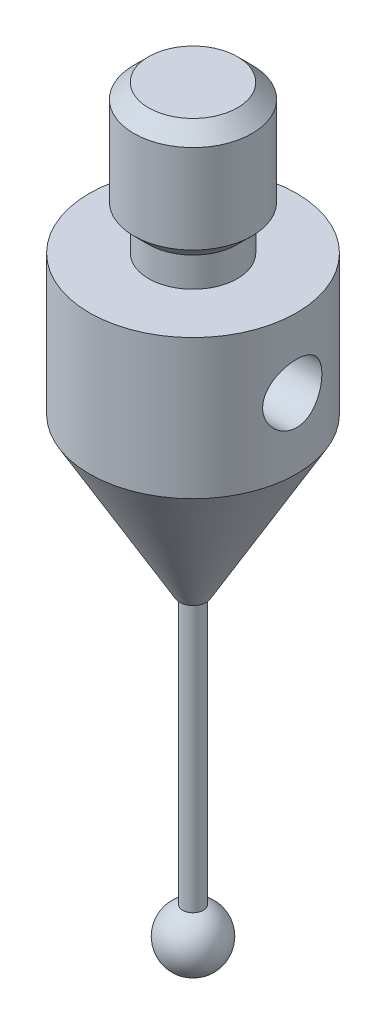
ISO-10303-21;
HEADER;
FILE_DESCRIPTION(('STEP AP214'),'2;1');
FILE_NAME('part.step','',(''),(''),'','','');
FILE_SCHEMA(('AUTOMOTIVE_DESIGN { 1 0 10303 214 1 1 1 1 }'));
ENDSEC;
DATA;
#1=APPLICATION_CONTEXT('core data for automotive mechanical design processes');
#2=APPLICATION_PROTOCOL_DEFINITION('international standard','automotive_design',2000,#1);
#3=PRODUCT_CONTEXT('',#1,'mechanical');
#4=PRODUCT('Part','Part','',(#3));
#5=PRODUCT_RELATED_PRODUCT_CATEGORY('part','',(#4));
#6=PRODUCT_DEFINITION_FORMATION('','',#4);
#7=PRODUCT_DEFINITION_CONTEXT('part definition',#1,'design');
#8=PRODUCT_DEFINITION('design','',#6,#7);
#9=PRODUCT_DEFINITION_SHAPE('','',#8);
#10=(LENGTH_UNIT() NAMED_UNIT(*) SI_UNIT(.MILLI.,.METRE.));
#11=(NAMED_UNIT(*) PLANE_ANGLE_UNIT() SI_UNIT($,.RADIAN.));
#12=(NAMED_UNIT(*) SI_UNIT($,.STERADIAN.) SOLID_ANGLE_UNIT());
#13=UNCERTAINTY_MEASURE_WITH_UNIT(LENGTH_MEASURE(1.E-05),#10,'distance_accuracy_value','');
#14=(GEOMETRIC_REPRESENTATION_CONTEXT(3) GLOBAL_UNCERTAINTY_ASSIGNED_CONTEXT((#13)) GLOBAL_UNIT_ASSIGNED_CONTEXT((#10,
#11,#12)) REPRESENTATION_CONTEXT('',''));
#15=CARTESIAN_POINT('',(0.,0.,0.));
#16=DIRECTION('',(0.,0.,1.));
#17=DIRECTION('',(1.,0.,0.));
#18=AXIS2_PLACEMENT_3D('',#15,#16,#17);
#19=CARTESIAN_POINT('',(0.,10.,0.));
#20=DIRECTION('',(0.,-1.,0.));
#21=DIRECTION('',(0.,0.,-1.));
#22=AXIS2_PLACEMENT_3D('',#19,#20,#21);
#23=CYLINDRICAL_SURFACE('',#22,0.35);
#24=CARTESIAN_POINT('',(0.,0.93674969975976,0.));
#25=DIRECTION('',(0.,-1.,0.));
#26=DIRECTION('',(0.,0.,-1.));
#27=AXIS2_PLACEMENT_3D('',#24,#25,#26);
#28=CIRCLE('',#27,0.35);
#29=CARTESIAN_POINT('',(0.,0.93674969975976,-0.35));
#30=VERTEX_POINT('',#29);
#31=EDGE_CURVE('E161',#30,#30,#28,.T.);
#32=ORIENTED_EDGE('',*,*,#31,.F.);
#33=EDGE_LOOP('',(#32));
#34=FACE_BOUND('',#33,.T.);
#35=CARTESIAN_POINT('',(0.,10.,0.));
#36=DIRECTION('',(0.,1.,0.));
#37=DIRECTION('',(0.,0.,1.));
#38=AXIS2_PLACEMENT_3D('',#35,#36,#37);
#39=CIRCLE('',#38,0.35);
#40=CARTESIAN_POINT('',(0.,10.,0.35));
#41=VERTEX_POINT('',#40);
#42=EDGE_CURVE('E157',#41,#41,#39,.T.);
#43=ORIENTED_EDGE('',*,*,#42,.F.);
#44=EDGE_LOOP('',(#43));
#45=FACE_BOUND('',#44,.T.);
#46=ADVANCED_FACE('F41',(#34,#45),#23,.T.);
#47=CARTESIAN_POINT('',(0.,0.,0.));
#48=DIRECTION('',(0.,-1.,0.));
#49=DIRECTION('',(1.,0.,0.));
#50=AXIS2_PLACEMENT_3D('',#47,#48,#49);
#51=SPHERICAL_SURFACE('',#50,1.);
#52=ORIENTED_EDGE('',*,*,#31,.T.);
#53=EDGE_LOOP('',(#52));
#54=FACE_BOUND('',#53,.T.);
#55=ADVANCED_FACE('F105',(#54),#51,.T.);
#56=CARTESIAN_POINT('',(0.,20.,0.));
#57=DIRECTION('',(0.,-1.,0.));
#58=DIRECTION('',(0.,0.,-1.));
#59=AXIS2_PLACEMENT_3D('',#56,#57,#58);
#60=CYLINDRICAL_SURFACE('',#59,3.5);
#61=CARTESIAN_POINT('',(-3.5,16.6413774815425,0.));
#62=CARTESIAN_POINT('',(-3.49999934647171,16.6413784513235,-0.0549774511886255));
#63=CARTESIAN_POINT('',(-3.49869208701023,16.6459263760306,-0.109964873936291));
#64=CARTESIAN_POINT('',(-3.49360452972549,16.6639596165937,-0.218345995598494));
#65=CARTESIAN_POINT('',(-3.48982329605034,16.6774483145796,-0.271739083414808));
#66=CARTESIAN_POINT('',(-3.48020345674544,16.7128815007508,-0.375352150368936));
#67=CARTESIAN_POINT('',(-3.474367720532,16.7348141996185,-0.425576440424113));
#68=CARTESIAN_POINT('',(-3.46124989158242,16.7864664772817,-0.521634380564634));
#69=CARTESIAN_POINT('',(-3.45396764753901,16.8161868707877,-0.567467570589078));
#70=CARTESIAN_POINT('',(-3.43852367312902,16.883394986879,-0.654647223429479));
#71=CARTESIAN_POINT('',(-3.4303452097302,16.9210498584703,-0.695861861190491));
#72=CARTESIAN_POINT('',(-3.41413367457396,17.0027013531112,-0.771485678962156));
#73=CARTESIAN_POINT('',(-3.40610062478085,17.0466989253581,-0.805893838538839));
#74=CARTESIAN_POINT('',(-3.39091507439313,17.1408742729386,-0.867598950032229));
#75=CARTESIAN_POINT('',(-3.38378351259108,17.1911584740771,-0.894739105517031));
#76=CARTESIAN_POINT('',(-3.37145671914235,17.2958134874158,-0.940125852769618));
#77=CARTESIAN_POINT('',(-3.36626107099664,17.3501834175701,-0.958374357777525));
#78=CARTESIAN_POINT('',(-3.35856804120241,17.4599948631266,-0.984992165068877));
#79=CARTESIAN_POINT('',(-3.35600489366891,17.5153731629416,-0.993602766016076));
#80=CARTESIAN_POINT('',(-3.35367104182518,17.6268430557842,-1.00145333894795));
#81=CARTESIAN_POINT('',(-3.35389973075333,17.6829344911757,-1.00069534704803));
#82=CARTESIAN_POINT('',(-3.35706517184156,17.7923117872693,-0.990020673813954));
#83=CARTESIAN_POINT('',(-3.35991391343389,17.8456296571326,-0.980401628641807));
#84=CARTESIAN_POINT('',(-3.36785674196985,17.9498610913567,-0.952756930429099));
#85=CARTESIAN_POINT('',(-3.37295103189705,18.0007744379029,-0.934730517406291));
#86=CARTESIAN_POINT('',(-3.38488431756517,18.0995006037583,-0.890553405689021));
#87=CARTESIAN_POINT('',(-3.39174458202416,18.1472660177433,-0.864302755864396));
#88=CARTESIAN_POINT('',(-3.40642608441438,18.2378157621493,-0.804491895839434));
#89=CARTESIAN_POINT('',(-3.41424753611068,18.28059898041,-0.770930058366727));
#90=CARTESIAN_POINT('',(-3.43033125328062,18.3616636693457,-0.695951998365102));
#91=CARTESIAN_POINT('',(-3.43859902286152,18.3997147195261,-0.654287437422663));
#92=CARTESIAN_POINT('',(-3.45438123609203,18.4683404833627,-0.565066141193114));
#93=CARTESIAN_POINT('',(-3.46189564068921,18.4989148095634,-0.517509100740947));
#94=CARTESIAN_POINT('',(-3.47538264032742,18.5518418489296,-0.417461536545724));
#95=CARTESIAN_POINT('',(-3.48134637748612,18.5741476249446,-0.364944908905003));
#96=CARTESIAN_POINT('',(-3.49099625743795,18.6095444272509,-0.256696614983735));
#97=CARTESIAN_POINT('',(-3.49468297428128,18.6226377761652,-0.200965762905073));
#98=CARTESIAN_POINT('',(-3.49927437257336,18.6388641243973,-0.0898331943221744));
#99=CARTESIAN_POINT('',(-3.50026636425301,18.642309829229,-0.0344806734302534));
#100=CARTESIAN_POINT('',(-3.49961042353544,18.640013848392,0.076013263402791));
#101=CARTESIAN_POINT('',(-3.49796280790308,18.6342732651196,0.131154703878552));
#102=CARTESIAN_POINT('',(-3.49226963342609,18.6140222593844,0.238509316715159));
#103=CARTESIAN_POINT('',(-3.48827306508862,18.5996908908808,0.290759105867427));
#104=CARTESIAN_POINT('',(-3.4783399937092,18.5628772305502,0.392104343102815));
#105=CARTESIAN_POINT('',(-3.47240326632854,18.5403939960979,0.441199425624337));
#106=CARTESIAN_POINT('',(-3.45904980584657,18.4873658132199,0.536020842560038));
#107=CARTESIAN_POINT('',(-3.45160381589487,18.4566568821296,0.581651243270128));
#108=CARTESIAN_POINT('',(-3.43608973548903,18.3882512285672,0.667219264029655));
#109=CARTESIAN_POINT('',(-3.42802150376367,18.3505529165111,0.707155585421215));
#110=CARTESIAN_POINT('',(-3.41184309815947,18.2677728105169,0.781553214170353));
#111=CARTESIAN_POINT('',(-3.40374018433795,18.2224898437597,0.815792713704769));
#112=CARTESIAN_POINT('',(-3.38869447362751,18.1266461872335,0.87619765803258));
#113=CARTESIAN_POINT('',(-3.3817516363796,18.0760856811693,0.902363383738854));
#114=CARTESIAN_POINT('',(-3.36989325638715,17.9713318760467,0.945687270594172));
#115=CARTESIAN_POINT('',(-3.36496700079018,17.9171595997562,0.962893166212217));
#116=CARTESIAN_POINT('',(-3.35771228398834,17.8065225137153,0.987897250353705));
#117=CARTESIAN_POINT('',(-3.35538303564047,17.7500584039915,0.995698289511612));
#118=CARTESIAN_POINT('',(-3.35365851547575,17.6387294650818,1.00149012123096));
#119=CARTESIAN_POINT('',(-3.35415580399703,17.5838847292662,0.999840138221142));
#120=CARTESIAN_POINT('',(-3.35777298607399,17.4752901162096,0.987623554788216));
#121=CARTESIAN_POINT('',(-3.36089279211716,17.421540202496,0.977057251899603));
#122=CARTESIAN_POINT('',(-3.36933488579116,17.3171882959588,0.947529844083143));
#123=CARTESIAN_POINT('',(-3.37463438524179,17.2665597880371,0.928655458931764));
#124=CARTESIAN_POINT('',(-3.38683651421364,17.1691481142963,0.883114746507969));
#125=CARTESIAN_POINT('',(-3.3937394274128,17.1223656309059,0.856447040215779));
#126=CARTESIAN_POINT('',(-3.40865834474881,17.0322857206399,0.795032732674125));
#127=CARTESIAN_POINT('',(-3.41670381589509,16.9891567858716,0.760046138613655));
#128=CARTESIAN_POINT('',(-3.43284922546139,16.9092655336376,0.683429920189677));
#129=CARTESIAN_POINT('',(-3.4409491770859,16.8725048219871,0.64179862536428));
#130=CARTESIAN_POINT('',(-3.45653979786176,16.8054588893792,0.551787160432696));
#131=CARTESIAN_POINT('',(-3.46400950518705,16.7753639879077,0.50326125117989));
#132=CARTESIAN_POINT('',(-3.47725697888987,16.7238045890315,0.401625264823331));
#133=CARTESIAN_POINT('',(-3.48303566935144,16.702335375576,0.34851771205737));
#134=CARTESIAN_POINT('',(-3.49163672362653,16.6709537058448,0.246458157667517));
#135=CARTESIAN_POINT('',(-3.49474842181038,16.6598907132003,0.197881503812195));
#136=CARTESIAN_POINT('',(-3.49893021926074,16.6451026529215,0.0995391843931838));
#137=CARTESIAN_POINT('',(-3.50000059166997,16.6413766035541,0.049773678808046));
#138=CARTESIAN_POINT('',(-3.5,16.6413774815425,0.));
#139=B_SPLINE_CURVE_WITH_KNOTS('',3,(#61,#62,#63,#64,#65,#66,#67,#68,#69,#70,#71,#72,#73,#74,
#75,#76,#77,#78,#79,#80,#81,#82,#83,#84,#85,#86,#87,#88,#89,#90,#91,#92,#93,#94,#95,#96,#97,#98,
#99,#100,#101,#102,#103,#104,#105,#106,#107,#108,#109,#110,#111,#112,#113,#114,#115,#116,#117,
#118,#119,#120,#121,#122,#123,#124,#125,#126,#127,#128,#129,#130,#131,#132,#133,#134,#135,#136,
#137,#138),.UNSPECIFIED.,.T.,.F.,(4,2,2,2,2,2,2,2,2,2,2,2,2,2,2,2,2,2,2,2,2,2,2,2,2,2,2,2,2,2,2,
2,2,2,2,2,2,2,4),(0.,0.164749656271172,0.32956166989759,0.494144406447671,0.65874436771758,
0.827239057653908,0.995758989368569,1.16766537650029,1.33953475772405,1.50699754929408,
1.67442394611628,1.83642392910678,1.99843855889074,2.16250401641616,2.32660602784683,
2.49689250297262,2.66718780073736,2.83843550548236,3.00964002003318,3.17522728845112,
3.34079468713336,3.50302570235771,3.66527548283776,3.83103762668237,3.99683751589905,
4.16806052438178,4.33927757478661,4.50957286677749,4.6798165288708,4.8436334080145,
5.00744482086203,5.16958548138846,5.33175484992002,5.49933828438395,5.6669639154745,
5.83888989478295,6.01072174610257,6.15989734012186,6.30905297207072),.UNSPECIFIED.);
#140=CARTESIAN_POINT('',(-3.5,16.6413774815425,0.));
#141=VERTEX_POINT('',#140);
#142=EDGE_CURVE('E63',#141,#141,#139,.T.);
#143=ORIENTED_EDGE('',*,*,#142,.T.);
#144=EDGE_LOOP('',(#143));
#145=FACE_BOUND('',#144,.T.);
#146=CARTESIAN_POINT('',(3.35410196624968,17.6413774815425,-1.));
#147=CARTESIAN_POINT('',(3.3541027352982,17.5864517126198,-0.999999010234619));
#148=CARTESIAN_POINT('',(3.35546589937234,17.5315159394628,-0.995459333009394));
#149=CARTESIAN_POINT('',(3.36075194701915,17.423241862155,-0.977461816962149));
#150=CARTESIAN_POINT('',(3.36467587174621,17.369904217001,-0.9640003506833));
#151=CARTESIAN_POINT('',(3.37460354734501,17.2664088810913,-0.928646716460411));
#152=CARTESIAN_POINT('',(3.38060407621639,17.2162464056298,-0.90676760325832));
#153=CARTESIAN_POINT('',(3.39400460555119,17.1202935757695,-0.855241820315742));
#154=CARTESIAN_POINT('',(3.40140477214508,17.0745037413546,-0.825594228332021));
#155=CARTESIAN_POINT('',(3.41700891605117,16.987281698884,-0.758462400490704));
#156=CARTESIAN_POINT('',(3.42522877981549,16.9459935804776,-0.720794605566171));
#157=CARTESIAN_POINT('',(3.44140982756535,16.8702260898909,-0.639085622734715));
#158=CARTESIAN_POINT('',(3.44937098116968,16.8357475149812,-0.595043689579839));
#159=CARTESIAN_POINT('',(3.46431666000611,16.7739631573657,-0.500823016078775));
#160=CARTESIAN_POINT('',(3.47128027250394,16.746802671667,-0.450545391880929));
#161=CARTESIAN_POINT('',(3.48326270242804,16.7013765943346,-0.345904237619826));
#162=CARTESIAN_POINT('',(3.48828189845443,16.6831092709224,-0.291541505437589));
#163=CARTESIAN_POINT('',(3.49569759650108,16.6564602509227,-0.181779287560588));
#164=CARTESIAN_POINT('',(3.49815913505649,16.6478329706902,-0.126443899064521));
#165=CARTESIAN_POINT('',(3.50041047829849,16.6399341146009,-0.0150600512109629));
#166=CARTESIAN_POINT('',(3.50020079369491,16.6406607503739,0.0409882697942736));
#167=CARTESIAN_POINT('',(3.49718003381653,16.6512806690015,0.15049009786761));
#168=CARTESIAN_POINT('',(3.49444435388027,16.6609082878615,0.203971773054472));
#169=CARTESIAN_POINT('',(3.48676943165067,16.6886250327747,0.308526111088808));
#170=CARTESIAN_POINT('',(3.48183005528105,16.7067146736736,0.359598627150254));
#171=CARTESIAN_POINT('',(3.47019515886062,16.7510321819484,0.458536916864462));
#172=CARTESIAN_POINT('',(3.46348102756093,16.7773468704467,0.506361521925387));
#173=CARTESIAN_POINT('',(3.44901384486994,16.8372997747415,0.597003621795242));
#174=CARTESIAN_POINT('',(3.44126056595877,16.8709395953758,0.639820016208004));
#175=CARTESIAN_POINT('',(3.42522841509913,16.9459803368518,0.720816324273877));
#176=CARTESIAN_POINT('',(3.41694064685079,16.9876121983451,0.758780788792453));
#177=CARTESIAN_POINT('',(3.4010148689311,17.0767350274655,0.827246507874877));
#178=CARTESIAN_POINT('',(3.39337691201241,17.1242264700169,0.857747156891287));
#179=CARTESIAN_POINT('',(3.37957587408658,17.2242429237916,0.910616679927255));
#180=CARTESIAN_POINT('',(3.37342505474766,17.2768050940688,0.932918688943925));
#181=CARTESIAN_POINT('',(3.36344272188227,17.3851540632944,0.968294757480381));
#182=CARTESIAN_POINT('',(3.35961053356452,17.4409399188709,0.981371502013291));
#183=CARTESIAN_POINT('',(3.35484557617748,17.5521176937044,0.997537085998827));
#184=CARTESIAN_POINT('',(3.35381855730447,17.607458390003,1.00095074078696));
#185=CARTESIAN_POINT('',(3.35452079870229,17.7179216395,0.998594983598455));
#186=CARTESIAN_POINT('',(3.35624971515342,17.7730442190498,0.992826717122485));
#187=CARTESIAN_POINT('',(3.36217715008271,17.8801980955578,0.972558907129289));
#188=CARTESIAN_POINT('',(3.3663182147774,17.9322712745511,0.958262310920607));
#189=CARTESIAN_POINT('',(3.37654531970352,18.0332784175404,0.921575809332241));
#190=CARTESIAN_POINT('',(3.38263164056921,18.0822119273651,0.899184736133867));
#191=CARTESIAN_POINT('',(3.3962509400331,18.1768885191512,0.846309825608092));
#192=CARTESIAN_POINT('',(3.40381598690189,18.2225227036437,0.815639458645651));
#193=CARTESIAN_POINT('',(3.41946863275287,18.3081156682641,0.747302318424216));
#194=CARTESIAN_POINT('',(3.42755634473907,18.3480732150486,0.709634028840688));
#195=CARTESIAN_POINT('',(3.44367363717939,18.4225671906866,0.626854004982778));
#196=CARTESIAN_POINT('',(3.45169203023043,18.4568749672519,0.581533855120275));
#197=CARTESIAN_POINT('',(3.46648988523027,18.5174003222339,0.485592653528774));
#198=CARTESIAN_POINT('',(3.47326941192714,18.5436183235037,0.434971879049092));
#199=CARTESIAN_POINT('',(3.48478252423195,18.5869696250557,0.330216636478082));
#200=CARTESIAN_POINT('',(3.48953154063622,18.6041716763356,0.276112399949817));
#201=CARTESIAN_POINT('',(3.49651669811944,18.6291908825126,0.165622824274961));
#202=CARTESIAN_POINT('',(3.4987534856151,18.6370104516332,0.109238075792719));
#203=CARTESIAN_POINT('',(3.50042667501642,18.6428731985414,-0.00208911897951403));
#204=CARTESIAN_POINT('',(3.49995851794498,18.6412495560839,-0.0570128155249779));
#205=CARTESIAN_POINT('',(3.49649534561067,18.6290583408374,-0.165772586211002));
#206=CARTESIAN_POINT('',(3.49350045135296,18.6184911963515,-0.219608712308766));
#207=CARTESIAN_POINT('',(3.48534400930059,18.5889118010531,-0.324202066519794));
#208=CARTESIAN_POINT('',(3.4802020702409,18.5699758920705,-0.374982516717526));
#209=CARTESIAN_POINT('',(3.46828547071724,18.5242644023998,-0.472673601380731));
#210=CARTESIAN_POINT('',(3.46151055750883,18.4974876079964,-0.519583635290341));
#211=CARTESIAN_POINT('',(3.44679477720104,18.4359288128301,-0.609716728176957));
#212=CARTESIAN_POINT('',(3.43882522893152,18.4009324381483,-0.65278866400354));
#213=CARTESIAN_POINT('',(3.42272032493228,18.3243229188156,-0.73256061115919));
#214=CARTESIAN_POINT('',(3.4145849239342,18.2827079460001,-0.769258856094888));
#215=CARTESIAN_POINT('',(3.39882018772077,18.1927290230449,-0.836204230145643));
#216=CARTESIAN_POINT('',(3.39120975884781,18.144216507791,-0.866256583618026));
#217=CARTESIAN_POINT('',(3.37764222665283,18.042616548885,-0.91773971809804));
#218=CARTESIAN_POINT('',(3.37168419857914,17.9895316859977,-0.93917532442409));
#219=CARTESIAN_POINT('',(3.36279229780033,17.8875506314268,-0.970492670062522));
#220=CARTESIAN_POINT('',(3.3595621942308,17.8390323074933,-0.981529499909266));
#221=CARTESIAN_POINT('',(3.35521684727178,17.7408044223646,-0.99628303521783));
#222=CARTESIAN_POINT('',(3.35410127012429,17.6910950504195,-1.00000089591333));
#223=CARTESIAN_POINT('',(3.35410196624968,17.6413774815425,-1.));
#224=B_SPLINE_CURVE_WITH_KNOTS('',3,(#146,#147,#148,#149,#150,#151,#152,#153,#154,#155,#156,
#157,#158,#159,#160,#161,#162,#163,#164,#165,#166,#167,#168,#169,#170,#171,#172,#173,#174,#175,
#176,#177,#178,#179,#180,#181,#182,#183,#184,#185,#186,#187,#188,#189,#190,#191,#192,#193,#194,
#195,#196,#197,#198,#199,#200,#201,#202,#203,#204,#205,#206,#207,#208,#209,#210,#211,#212,#213,
#214,#215,#216,#217,#218,#219,#220,#221,#222,#223),.UNSPECIFIED.,.T.,.F.,(4,2,2,2,2,2,2,2,2,2,2,
2,2,2,2,2,2,2,2,2,2,2,2,2,2,2,2,2,2,2,2,2,2,2,2,2,2,2,4),(0.,0.164594171159105,0.32925530476515,
0.493662091823938,0.65808840545939,0.826785835988799,0.995503006148135,1.16735741502495,
1.33917834504425,1.50651450509943,1.67381867271781,1.83628518817283,1.99876158968833,
2.16301451684818,2.3273034658799,2.49735806342072,2.66742645310452,2.83885260310575,
3.01022883892078,3.17577181660546,3.34129414341279,3.5030264482031,3.66478209600074,
3.83054003013244,3.99633392302106,4.16772694180382,4.33911100034378,4.50916842641099,
4.67918208530373,4.84323448834084,5.00727903537341,5.16985706186659,5.33246026763666,
5.4998988436474,5.66738374949711,5.83926806202707,6.01105598599879,6.16006644425301,
6.30905338065555),.UNSPECIFIED.);
#225=CARTESIAN_POINT('',(3.35410196624968,17.6413774815425,-1.));
#226=VERTEX_POINT('',#225);
#227=EDGE_CURVE('E72',#226,#226,#224,.T.);
#228=ORIENTED_EDGE('',*,*,#227,.T.);
#229=EDGE_LOOP('',(#228));
#230=FACE_BOUND('',#229,.T.);
#231=CARTESIAN_POINT('',(0.,15.2827549630851,0.));
#232=DIRECTION('',(0.,1.,0.));
#233=DIRECTION('',(0.,0.,1.));
#234=AXIS2_PLACEMENT_3D('',#231,#232,#233);
#235=CIRCLE('',#234,3.5);
#236=CARTESIAN_POINT('',(0.,15.2827549630851,3.5));
#237=VERTEX_POINT('',#236);
#238=EDGE_CURVE('E165',#237,#237,#235,.T.);
#239=ORIENTED_EDGE('',*,*,#238,.T.);
#240=EDGE_LOOP('',(#239));
#241=FACE_BOUND('',#240,.T.);
#242=CARTESIAN_POINT('',(0.,20.,0.));
#243=DIRECTION('',(0.,1.,0.));
#244=DIRECTION('',(0.,0.,1.));
#245=AXIS2_PLACEMENT_3D('',#242,#243,#244);
#246=CIRCLE('',#245,3.5);
#247=CARTESIAN_POINT('',(0.,20.,3.5));
#248=VERTEX_POINT('',#247);
#249=EDGE_CURVE('E153',#248,#248,#246,.T.);
#250=ORIENTED_EDGE('',*,*,#249,.F.);
#251=EDGE_LOOP('',(#250));
#252=FACE_BOUND('',#251,.T.);
#253=ADVANCED_FACE('F77',(#145,#230,#241,#252),#60,.T.);
#254=CARTESIAN_POINT('',(0.,20.,0.));
#255=DIRECTION('',(0.,1.,0.));
#256=DIRECTION('',(0.,0.,1.));
#257=AXIS2_PLACEMENT_3D('',#254,#255,#256);
#258=PLANE('',#257);
#259=CARTESIAN_POINT('',(0.,20.,0.));
#260=DIRECTION('',(0.,1.,0.));
#261=DIRECTION('',(0.,0.,1.));
#262=AXIS2_PLACEMENT_3D('',#259,#260,#261);
#263=CIRCLE('',#262,1.5);
#264=CARTESIAN_POINT('',(0.,20.,1.5));
#265=VERTEX_POINT('',#264);
#266=EDGE_CURVE('E60',#265,#265,#263,.T.);
#267=ORIENTED_EDGE('',*,*,#266,.F.);
#268=EDGE_LOOP('',(#267));
#269=FACE_BOUND('',#268,.T.);
#270=ORIENTED_EDGE('',*,*,#249,.T.);
#271=EDGE_LOOP('',(#270));
#272=FACE_BOUND('',#271,.T.);
#273=ADVANCED_FACE('F90',(#269,#272),#258,.T.);
#274=CARTESIAN_POINT('',(0.,10.,0.));
#275=DIRECTION('',(0.,1.,0.));
#276=DIRECTION('',(0.,0.,1.));
#277=AXIS2_PLACEMENT_3D('',#274,#275,#276);
#278=PLANE('',#277);
#279=CARTESIAN_POINT('',(0.,10.,0.));
#280=DIRECTION('',(0.,1.,0.));
#281=DIRECTION('',(0.,0.,1.));
#282=AXIS2_PLACEMENT_3D('',#279,#280,#281);
#283=CIRCLE('',#282,0.449999999999996);
#284=CARTESIAN_POINT('',(0.,10.,0.449999999999994));
#285=VERTEX_POINT('',#284);
#286=EDGE_CURVE('E168',#285,#285,#283,.F.);
#287=ORIENTED_EDGE('',*,*,#286,.T.);
#288=EDGE_LOOP('',(#287));
#289=FACE_BOUND('',#288,.T.);
#290=ORIENTED_EDGE('',*,*,#42,.T.);
#291=EDGE_LOOP('',(#290));
#292=FACE_BOUND('',#291,.T.);
#293=ADVANCED_FACE('F93',(#289,#292),#278,.F.);
#294=CARTESIAN_POINT('',(0.,15.2827549630851,0.));
#295=DIRECTION('',(0.,1.,0.));
#296=DIRECTION('',(0.,0.,1.));
#297=AXIS2_PLACEMENT_3D('',#294,#295,#296);
#298=CONICAL_SURFACE('',#297,3.5,0.5235987755983);
#299=CARTESIAN_POINT('',(0.,10.,0.449999999999994));
#300=CARTESIAN_POINT('',(0.,10.0550286975321,0.481770833333328));
#301=CARTESIAN_POINT('',(0.,10.1100573950643,0.513541666666661));
#302=CARTESIAN_POINT('',(0.,10.2201147901285,0.577083333333328));
#303=CARTESIAN_POINT('',(0.,10.2751434876607,0.608854166666661));
#304=CARTESIAN_POINT('',(0.,10.385200882725,0.672395833333328));
#305=CARTESIAN_POINT('',(0.,10.4402295802571,0.704166666666662));
#306=CARTESIAN_POINT('',(0.,10.5502869753214,0.767708333333328));
#307=CARTESIAN_POINT('',(0.,10.6053156728535,0.799479166666662));
#308=CARTESIAN_POINT('',(0.,10.7153730679178,0.863020833333328));
#309=CARTESIAN_POINT('',(0.,10.7704017654499,0.894791666666662));
#310=CARTESIAN_POINT('',(0.,10.8804591605142,0.958333333333328));
#311=CARTESIAN_POINT('',(0.,10.9354878580463,0.990104166666662));
#312=CARTESIAN_POINT('',(0.,11.0455452531106,1.05364583333333));
#313=CARTESIAN_POINT('',(0.,11.1005739506427,1.08541666666666));
#314=CARTESIAN_POINT('',(0.,11.210631345707,1.14895833333333));
#315=CARTESIAN_POINT('',(0.,11.2656600432391,1.18072916666666));
#316=CARTESIAN_POINT('',(0.,11.3757174383034,1.24427083333333));
#317=CARTESIAN_POINT('',(0.,11.4307461358355,1.27604166666666));
#318=CARTESIAN_POINT('',(0.,11.5408035308998,1.33958333333333));
#319=CARTESIAN_POINT('',(0.,11.5958322284319,1.37135416666666));
#320=CARTESIAN_POINT('',(0.,11.7058896234962,1.43489583333333));
#321=CARTESIAN_POINT('',(0.,11.7609183210284,1.46666666666666));
#322=CARTESIAN_POINT('',(0.,11.8709757160926,1.53020833333333));
#323=CARTESIAN_POINT('',(0.,11.9260044136248,1.56197916666666));
#324=CARTESIAN_POINT('',(0.,12.036061808689,1.62552083333333));
#325=CARTESIAN_POINT('',(0.,12.0910905062212,1.65729166666666));
#326=CARTESIAN_POINT('',(0.,12.2011479012854,1.72083333333333));
#327=CARTESIAN_POINT('',(0.,12.2561765988176,1.75260416666666));
#328=CARTESIAN_POINT('',(0.,12.3662339938819,1.81614583333333));
#329=CARTESIAN_POINT('',(0.,12.421262691414,1.84791666666666));
#330=CARTESIAN_POINT('',(0.,12.5313200864783,1.91145833333333));
#331=CARTESIAN_POINT('',(0.,12.5863487840104,1.94322916666666));
#332=CARTESIAN_POINT('',(0.,12.6964061790747,2.00677083333333));
#333=CARTESIAN_POINT('',(0.,12.7514348766068,2.03854166666666));
#334=CARTESIAN_POINT('',(0.,12.8614922716711,2.10208333333333));
#335=CARTESIAN_POINT('',(0.,12.9165209692032,2.13385416666666));
#336=CARTESIAN_POINT('',(0.,13.0265783642675,2.19739583333333));
#337=CARTESIAN_POINT('',(0.,13.0816070617996,2.22916666666666));
#338=CARTESIAN_POINT('',(0.,13.1916644568639,2.29270833333333));
#339=CARTESIAN_POINT('',(0.,13.246693154396,2.32447916666666));
#340=CARTESIAN_POINT('',(0.,13.3567505494603,2.38802083333333));
#341=CARTESIAN_POINT('',(0.,13.4117792469924,2.41979166666666));
#342=CARTESIAN_POINT('',(0.,13.5218366420567,2.48333333333333));
#343=CARTESIAN_POINT('',(0.,13.5768653395888,2.51510416666666));
#344=CARTESIAN_POINT('',(0.,13.6869227346531,2.57864583333333));
#345=CARTESIAN_POINT('',(0.,13.7419514321853,2.61041666666666));
#346=CARTESIAN_POINT('',(0.,13.8520088272495,2.67395833333333));
#347=CARTESIAN_POINT('',(0.,13.9070375247817,2.70572916666666));
#348=CARTESIAN_POINT('',(0.,14.0170949198459,2.76927083333333));
#349=CARTESIAN_POINT('',(0.,14.0721236173781,2.80104166666666));
#350=CARTESIAN_POINT('',(0.,14.1821810124423,2.86458333333333));
#351=CARTESIAN_POINT('',(0.,14.2372097099745,2.89635416666667));
#352=CARTESIAN_POINT('',(0.,14.3472671050388,2.95989583333333));
#353=CARTESIAN_POINT('',(0.,14.4022958025709,2.99166666666666));
#354=CARTESIAN_POINT('',(0.,14.5123531976352,3.05520833333333));
#355=CARTESIAN_POINT('',(0.,14.5673818951673,3.08697916666666));
#356=CARTESIAN_POINT('',(0.,14.6774392902316,3.15052083333333));
#357=CARTESIAN_POINT('',(0.,14.7324679877637,3.18229166666667));
#358=CARTESIAN_POINT('',(0.,14.842525382828,3.24583333333333));
#359=CARTESIAN_POINT('',(0.,14.8975540803601,3.27760416666667));
#360=CARTESIAN_POINT('',(0.,15.0076114754244,3.34114583333333));
#361=CARTESIAN_POINT('',(0.,15.0626401729565,3.37291666666667));
#362=CARTESIAN_POINT('',(0.,15.1726975680208,3.43645833333333));
#363=CARTESIAN_POINT('',(0.,15.2277262655529,3.46822916666667));
#364=CARTESIAN_POINT('',(0.,15.2827549630851,3.5));
#365=B_SPLINE_CURVE_WITH_KNOTS('',3,(#299,#300,#301,#302,#303,#304,#305,#306,#307,#308,#309,
#310,#311,#312,#313,#314,#315,#316,#317,#318,#319,#320,#321,#322,#323,#324,#325,#326,#327,#328,
#329,#330,#331,#332,#333,#334,#335,#336,#337,#338,#339,#340,#341,#342,#343,#344,#345,#346,#347,
#348,#349,#350,#351,#352,#353,#354,#355,#356,#357,#358,#359,#360,#361,#362,#363,#364),
.UNSPECIFIED.,.F.,.F.,(4,2,2,2,2,2,2,2,2,2,2,2,2,2,2,2,2,2,2,2,2,2,2,2,2,2,2,2,2,2,2,2,4),(0.,
0.190624999999999,0.381250000000001,0.571875,0.762500000000002,0.953125000000001,1.14375,
1.334375,1.525,1.715625,1.90625,2.096875,2.2875,2.478125,2.66875,2.859375,3.05,3.240625,3.43125,
3.621875,3.8125,4.003125,4.19375,4.384375,4.575,4.765625,4.95625,5.146875,5.3375,5.528125,
5.71875,5.909375,6.1),.UNSPECIFIED.);
#366=EDGE_CURVE('BSEAM87',#285,#237,#365,.T.);
#367=ORIENTED_EDGE('',*,*,#286,.F.);
#368=ORIENTED_EDGE('',*,*,#238,.F.);
#369=ORIENTED_EDGE('',*,*,#366,.T.);
#370=ORIENTED_EDGE('',*,*,#366,.F.);
#371=EDGE_LOOP('',(#367,#369,#368,#370));
#372=FACE_BOUND('',#371,.T.);
#373=ADVANCED_FACE('F87',(#372),#298,.T.);
#374=CARTESIAN_POINT('',(-3.5,17.6413774815425,0.));
#375=DIRECTION('',(1.,0.,0.));
#376=DIRECTION('',(0.,0.,-1.));
#377=AXIS2_PLACEMENT_3D('',#374,#375,#376);
#378=CYLINDRICAL_SURFACE('',#377,1.);
#379=ORIENTED_EDGE('',*,*,#227,.F.);
#380=EDGE_LOOP('',(#379));
#381=FACE_BOUND('',#380,.T.);
#382=ORIENTED_EDGE('',*,*,#142,.F.);
#383=EDGE_LOOP('',(#382));
#384=FACE_BOUND('',#383,.T.);
#385=ADVANCED_FACE('F81',(#381,#384),#378,.F.);
#386=CARTESIAN_POINT('',(0.,21.,0.));
#387=DIRECTION('',(0.,-1.,0.));
#388=DIRECTION('',(0.,0.,-1.));
#389=AXIS2_PLACEMENT_3D('',#386,#387,#388);
#390=CYLINDRICAL_SURFACE('',#389,1.5);
#391=CARTESIAN_POINT('',(0.,21.,0.));
#392=DIRECTION('',(0.,1.,0.));
#393=DIRECTION('',(0.,0.,1.));
#394=AXIS2_PLACEMENT_3D('',#391,#392,#393);
#395=CIRCLE('',#394,1.5);
#396=CARTESIAN_POINT('',(0.,21.,1.5));
#397=VERTEX_POINT('',#396);
#398=EDGE_CURVE('E146',#397,#397,#395,.T.);
#399=ORIENTED_EDGE('',*,*,#398,.F.);
#400=EDGE_LOOP('',(#399));
#401=FACE_BOUND('',#400,.T.);
#402=ORIENTED_EDGE('',*,*,#266,.T.);
#403=EDGE_LOOP('',(#402));
#404=FACE_BOUND('',#403,.T.);
#405=ADVANCED_FACE('F86',(#401,#404),#390,.T.);
#406=CARTESIAN_POINT('',(0.,25.,0.));
#407=DIRECTION('',(0.,-1.,0.));
#408=DIRECTION('',(0.,0.,-1.));
#409=AXIS2_PLACEMENT_3D('',#406,#407,#408);
#410=CYLINDRICAL_SURFACE('',#409,2.);
#411=CARTESIAN_POINT('',(0.,24.5,0.));
#412=DIRECTION('',(0.,1.,0.));
#413=DIRECTION('',(0.,0.,1.));
#414=AXIS2_PLACEMENT_3D('',#411,#412,#413);
#415=CIRCLE('',#414,2.);
#416=CARTESIAN_POINT('',(0.,24.5,2.));
#417=VERTEX_POINT('',#416);
#418=EDGE_CURVE('E10',#417,#417,#415,.F.);
#419=ORIENTED_EDGE('',*,*,#418,.T.);
#420=EDGE_LOOP('',(#419));
#421=FACE_BOUND('',#420,.T.);
#422=CARTESIAN_POINT('',(0.,21.5,0.));
#423=DIRECTION('',(0.,1.,0.));
#424=DIRECTION('',(0.,0.,1.));
#425=AXIS2_PLACEMENT_3D('',#422,#423,#424);
#426=CIRCLE('',#425,2.);
#427=CARTESIAN_POINT('',(0.,21.5,2.));
#428=VERTEX_POINT('',#427);
#429=EDGE_CURVE('E50',#428,#428,#426,.T.);
#430=ORIENTED_EDGE('',*,*,#429,.T.);
#431=EDGE_LOOP('',(#430));
#432=FACE_BOUND('',#431,.T.);
#433=ADVANCED_FACE('F129',(#421,#432),#410,.T.);
#434=CARTESIAN_POINT('',(0.,25.,0.));
#435=DIRECTION('',(0.,1.,0.));
#436=DIRECTION('',(0.,0.,1.));
#437=AXIS2_PLACEMENT_3D('',#434,#435,#436);
#438=PLANE('',#437);
#439=CARTESIAN_POINT('',(0.,25.,0.));
#440=DIRECTION('',(0.,1.,0.));
#441=DIRECTION('',(0.,0.,1.));
#442=AXIS2_PLACEMENT_3D('',#439,#440,#441);
#443=CIRCLE('',#442,1.5);
#444=CARTESIAN_POINT('',(0.,25.,1.5));
#445=VERTEX_POINT('',#444);
#446=EDGE_CURVE('E55',#445,#445,#443,.T.);
#447=ORIENTED_EDGE('',*,*,#446,.T.);
#448=EDGE_LOOP('',(#447));
#449=FACE_BOUND('',#448,.T.);
#450=ADVANCED_FACE('F122',(#449),#438,.T.);
#451=CARTESIAN_POINT('',(0.,25.,0.));
#452=DIRECTION('',(0.,-1.,0.));
#453=DIRECTION('',(0.,0.,-1.));
#454=AXIS2_PLACEMENT_3D('',#451,#452,#453);
#455=CONICAL_SURFACE('',#454,1.5,0.78539816339745);
#456=ORIENTED_EDGE('',*,*,#418,.F.);
#457=EDGE_LOOP('',(#456));
#458=FACE_BOUND('',#457,.T.);
#459=ORIENTED_EDGE('',*,*,#446,.F.);
#460=EDGE_LOOP('',(#459));
#461=FACE_BOUND('',#460,.T.);
#462=ADVANCED_FACE('F118',(#458,#461),#455,.T.);
#463=CARTESIAN_POINT('',(0.,21.5,0.));
#464=DIRECTION('',(0.,1.,0.));
#465=DIRECTION('',(0.,0.,1.));
#466=AXIS2_PLACEMENT_3D('',#463,#464,#465);
#467=CONICAL_SURFACE('',#466,2.,0.785398163397453);
#468=ORIENTED_EDGE('',*,*,#398,.T.);
#469=EDGE_LOOP('',(#468));
#470=FACE_BOUND('',#469,.T.);
#471=ORIENTED_EDGE('',*,*,#429,.F.);
#472=EDGE_LOOP('',(#471));
#473=FACE_BOUND('',#472,.T.);
#474=ADVANCED_FACE('F44',(#470,#473),#467,.T.);
#475=CLOSED_SHELL('',(#46,#55,#253,#273,#293,#373,#385,#405,#433,#450,#462,#474));
#476=MANIFOLD_SOLID_BREP('B2',#475);
#477=ADVANCED_BREP_SHAPE_REPRESENTATION('',(#18,#476),#14);
#478=SHAPE_DEFINITION_REPRESENTATION(#9,#477);
ENDSEC;
END-ISO-10303-21;
